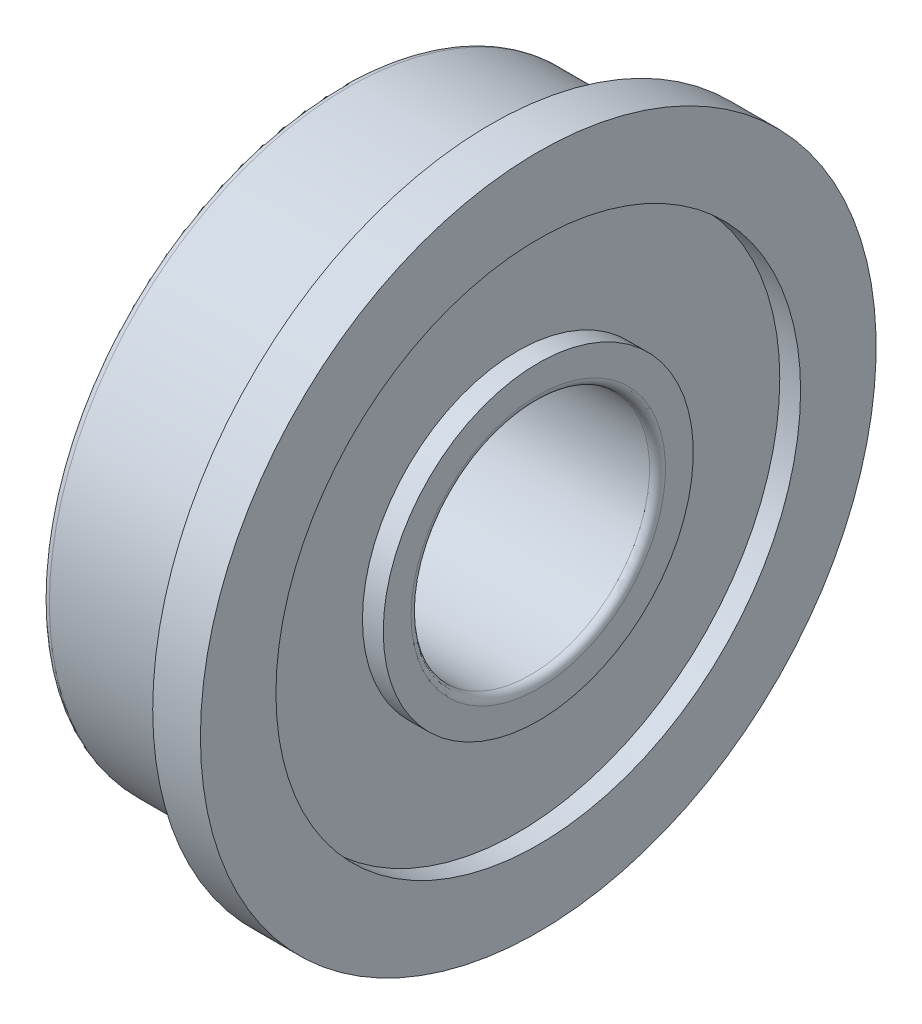
ISO-10303-21;
HEADER;
FILE_DESCRIPTION(('STEP AP214'),'2;1');
FILE_NAME('part.step','',(''),(''),'','','');
FILE_SCHEMA(('AUTOMOTIVE_DESIGN { 1 0 10303 214 1 1 1 1 }'));
ENDSEC;
DATA;
#1=APPLICATION_CONTEXT('core data for automotive mechanical design processes');
#2=APPLICATION_PROTOCOL_DEFINITION('international standard','automotive_design',2000,#1);
#3=PRODUCT_CONTEXT('',#1,'mechanical');
#4=PRODUCT('Part','Part','',(#3));
#5=PRODUCT_RELATED_PRODUCT_CATEGORY('part','',(#4));
#6=PRODUCT_DEFINITION_FORMATION('','',#4);
#7=PRODUCT_DEFINITION_CONTEXT('part definition',#1,'design');
#8=PRODUCT_DEFINITION('design','',#6,#7);
#9=PRODUCT_DEFINITION_SHAPE('','',#8);
#10=(LENGTH_UNIT() NAMED_UNIT(*) SI_UNIT(.MILLI.,.METRE.));
#11=(NAMED_UNIT(*) PLANE_ANGLE_UNIT() SI_UNIT($,.RADIAN.));
#12=(NAMED_UNIT(*) SI_UNIT($,.STERADIAN.) SOLID_ANGLE_UNIT());
#13=UNCERTAINTY_MEASURE_WITH_UNIT(LENGTH_MEASURE(1.E-05),#10,'distance_accuracy_value','');
#14=(GEOMETRIC_REPRESENTATION_CONTEXT(3) GLOBAL_UNCERTAINTY_ASSIGNED_CONTEXT((#13)) GLOBAL_UNIT_ASSIGNED_CONTEXT((#10,
#11,#12)) REPRESENTATION_CONTEXT('',''));
#15=CARTESIAN_POINT('',(0.,0.,0.));
#16=DIRECTION('',(0.,0.,1.));
#17=DIRECTION('',(1.,0.,0.));
#18=AXIS2_PLACEMENT_3D('',#15,#16,#17);
#19=CARTESIAN_POINT('',(0.200000000000016,0.,0.));
#20=DIRECTION('',(-1.,0.,0.));
#21=DIRECTION('',(0.,0.,1.));
#22=AXIS2_PLACEMENT_3D('',#19,#20,#21);
#23=TOROIDAL_SURFACE('',#22,7.29999999999998,0.200000000000016);
#24=CARTESIAN_POINT('',(0.,0.,0.));
#25=DIRECTION('',(-1.,0.,0.));
#26=DIRECTION('',(0.,0.,1.));
#27=AXIS2_PLACEMENT_3D('',#24,#25,#26);
#28=CIRCLE('',#27,7.3);
#29=CARTESIAN_POINT('',(0.,0.,7.3));
#30=VERTEX_POINT('',#29);
#31=EDGE_CURVE('E10',#30,#30,#28,.T.);
#32=ORIENTED_EDGE('',*,*,#31,.F.);
#33=EDGE_LOOP('',(#32));
#34=FACE_BOUND('',#33,.T.);
#35=CARTESIAN_POINT('',(0.200000000000001,0.,0.));
#36=DIRECTION('',(-1.,0.,0.));
#37=DIRECTION('',(0.,0.,1.));
#38=AXIS2_PLACEMENT_3D('',#35,#36,#37);
#39=CIRCLE('',#38,7.5);
#40=CARTESIAN_POINT('',(0.200000000000001,0.,7.5));
#41=VERTEX_POINT('',#40);
#42=EDGE_CURVE('E91',#41,#41,#39,.T.);
#43=ORIENTED_EDGE('',*,*,#42,.T.);
#44=EDGE_LOOP('',(#43));
#45=FACE_BOUND('',#44,.T.);
#46=ADVANCED_FACE('F33',(#34,#45),#23,.T.);
#47=CARTESIAN_POINT('',(0.,7.3,0.));
#48=DIRECTION('',(1.,0.,0.));
#49=DIRECTION('',(0.,0.,-1.));
#50=AXIS2_PLACEMENT_3D('',#47,#48,#49);
#51=PLANE('',#50);
#52=CARTESIAN_POINT('',(0.,0.,0.));
#53=DIRECTION('',(-1.,0.,0.));
#54=DIRECTION('',(0.,0.,1.));
#55=AXIS2_PLACEMENT_3D('',#52,#53,#54);
#56=CIRCLE('',#55,6.6);
#57=CARTESIAN_POINT('',(0.,0.,6.6));
#58=VERTEX_POINT('',#57);
#59=EDGE_CURVE('E39',#58,#58,#56,.T.);
#60=ORIENTED_EDGE('',*,*,#59,.F.);
#61=EDGE_LOOP('',(#60));
#62=FACE_BOUND('',#61,.T.);
#63=ORIENTED_EDGE('',*,*,#31,.T.);
#64=EDGE_LOOP('',(#63));
#65=FACE_BOUND('',#64,.T.);
#66=ADVANCED_FACE('F188',(#62,#65),#51,.F.);
#67=CARTESIAN_POINT('',(15.,0.,0.));
#68=DIRECTION('',(-1.,0.,0.));
#69=DIRECTION('',(0.,0.,1.));
#70=AXIS2_PLACEMENT_3D('',#67,#68,#69);
#71=CYLINDRICAL_SURFACE('',#70,6.6);
#72=CARTESIAN_POINT('',(0.52375,0.,0.));
#73=DIRECTION('',(-1.,0.,0.));
#74=DIRECTION('',(0.,0.,1.));
#75=AXIS2_PLACEMENT_3D('',#72,#73,#74);
#76=CIRCLE('',#75,6.6);
#77=CARTESIAN_POINT('',(0.52375,0.,6.6));
#78=VERTEX_POINT('',#77);
#79=EDGE_CURVE('E43',#78,#78,#76,.T.);
#80=ORIENTED_EDGE('',*,*,#79,.F.);
#81=EDGE_LOOP('',(#80));
#82=FACE_BOUND('',#81,.T.);
#83=ORIENTED_EDGE('',*,*,#59,.T.);
#84=EDGE_LOOP('',(#83));
#85=FACE_BOUND('',#84,.T.);
#86=ADVANCED_FACE('F183',(#82,#85),#71,.F.);
#87=CARTESIAN_POINT('',(0.52375,6.6,0.));
#88=DIRECTION('',(1.,0.,0.));
#89=DIRECTION('',(0.,0.,-1.));
#90=AXIS2_PLACEMENT_3D('',#87,#88,#89);
#91=PLANE('',#90);
#92=CARTESIAN_POINT('',(0.52375,0.,0.));
#93=DIRECTION('',(-1.,0.,0.));
#94=DIRECTION('',(0.,0.,1.));
#95=AXIS2_PLACEMENT_3D('',#92,#93,#94);
#96=CIRCLE('',#95,3.9);
#97=CARTESIAN_POINT('',(0.52375,0.,3.9));
#98=VERTEX_POINT('',#97);
#99=EDGE_CURVE('E47',#98,#98,#96,.T.);
#100=ORIENTED_EDGE('',*,*,#99,.F.);
#101=EDGE_LOOP('',(#100));
#102=FACE_BOUND('',#101,.T.);
#103=ORIENTED_EDGE('',*,*,#79,.T.);
#104=EDGE_LOOP('',(#103));
#105=FACE_BOUND('',#104,.T.);
#106=ADVANCED_FACE('F177',(#102,#105),#91,.F.);
#107=CARTESIAN_POINT('',(15.,0.,0.));
#108=DIRECTION('',(-1.,0.,0.));
#109=DIRECTION('',(0.,0.,1.));
#110=AXIS2_PLACEMENT_3D('',#107,#108,#109);
#111=CYLINDRICAL_SURFACE('',#110,3.9);
#112=CARTESIAN_POINT('',(0.,0.,0.));
#113=DIRECTION('',(-1.,0.,0.));
#114=DIRECTION('',(0.,0.,1.));
#115=AXIS2_PLACEMENT_3D('',#112,#113,#114);
#116=CIRCLE('',#115,3.9);
#117=CARTESIAN_POINT('',(0.,0.,3.9));
#118=VERTEX_POINT('',#117);
#119=EDGE_CURVE('E52',#118,#118,#116,.T.);
#120=ORIENTED_EDGE('',*,*,#119,.F.);
#121=EDGE_LOOP('',(#120));
#122=FACE_BOUND('',#121,.T.);
#123=ORIENTED_EDGE('',*,*,#99,.T.);
#124=EDGE_LOOP('',(#123));
#125=FACE_BOUND('',#124,.T.);
#126=ADVANCED_FACE('F171',(#122,#125),#111,.T.);
#127=CARTESIAN_POINT('',(0.,3.9,0.));
#128=DIRECTION('',(1.,0.,0.));
#129=DIRECTION('',(0.,0.,-1.));
#130=AXIS2_PLACEMENT_3D('',#127,#128,#129);
#131=PLANE('',#130);
#132=CARTESIAN_POINT('',(0.,0.,0.));
#133=DIRECTION('',(-1.,0.,0.));
#134=DIRECTION('',(0.,0.,1.));
#135=AXIS2_PLACEMENT_3D('',#132,#133,#134);
#136=CIRCLE('',#135,3.2);
#137=CARTESIAN_POINT('',(0.,0.,3.2));
#138=VERTEX_POINT('',#137);
#139=EDGE_CURVE('E55',#138,#138,#136,.T.);
#140=ORIENTED_EDGE('',*,*,#139,.F.);
#141=EDGE_LOOP('',(#140));
#142=FACE_BOUND('',#141,.T.);
#143=ORIENTED_EDGE('',*,*,#119,.T.);
#144=EDGE_LOOP('',(#143));
#145=FACE_BOUND('',#144,.T.);
#146=ADVANCED_FACE('F165',(#142,#145),#131,.F.);
#147=CARTESIAN_POINT('',(0.200000000000015,0.,0.));
#148=DIRECTION('',(-1.,0.,0.));
#149=DIRECTION('',(0.,0.,1.));
#150=AXIS2_PLACEMENT_3D('',#147,#148,#149);
#151=TOROIDAL_SURFACE('',#150,3.20000000000002,0.200000000000015);
#152=CARTESIAN_POINT('',(0.200000000000001,0.,0.));
#153=DIRECTION('',(-1.,0.,0.));
#154=DIRECTION('',(0.,0.,1.));
#155=AXIS2_PLACEMENT_3D('',#152,#153,#154);
#156=CIRCLE('',#155,3.);
#157=CARTESIAN_POINT('',(0.200000000000001,0.,3.));
#158=VERTEX_POINT('',#157);
#159=EDGE_CURVE('E58',#158,#158,#156,.T.);
#160=ORIENTED_EDGE('',*,*,#159,.F.);
#161=EDGE_LOOP('',(#160));
#162=FACE_BOUND('',#161,.T.);
#163=ORIENTED_EDGE('',*,*,#139,.T.);
#164=EDGE_LOOP('',(#163));
#165=FACE_BOUND('',#164,.T.);
#166=ADVANCED_FACE('F159',(#162,#165),#151,.T.);
#167=CARTESIAN_POINT('',(15.,0.,0.));
#168=DIRECTION('',(-1.,0.,0.));
#169=DIRECTION('',(0.,0.,1.));
#170=AXIS2_PLACEMENT_3D('',#167,#168,#169);
#171=CYLINDRICAL_SURFACE('',#170,3.);
#172=CARTESIAN_POINT('',(4.8,0.,0.));
#173=DIRECTION('',(-1.,0.,0.));
#174=DIRECTION('',(0.,0.,1.));
#175=AXIS2_PLACEMENT_3D('',#172,#173,#174);
#176=CIRCLE('',#175,3.);
#177=CARTESIAN_POINT('',(4.8,0.,3.));
#178=VERTEX_POINT('',#177);
#179=EDGE_CURVE('E61',#178,#178,#176,.T.);
#180=ORIENTED_EDGE('',*,*,#179,.F.);
#181=EDGE_LOOP('',(#180));
#182=FACE_BOUND('',#181,.T.);
#183=ORIENTED_EDGE('',*,*,#159,.T.);
#184=EDGE_LOOP('',(#183));
#185=FACE_BOUND('',#184,.T.);
#186=ADVANCED_FACE('F153',(#182,#185),#171,.F.);
#187=CARTESIAN_POINT('',(4.79999999999997,0.,0.));
#188=DIRECTION('',(-1.,0.,0.));
#189=DIRECTION('',(0.,0.,1.));
#190=AXIS2_PLACEMENT_3D('',#187,#188,#189);
#191=TOROIDAL_SURFACE('',#190,3.20000000000003,0.200000000000033);
#192=CARTESIAN_POINT('',(5.,0.,0.));
#193=DIRECTION('',(-1.,0.,0.));
#194=DIRECTION('',(0.,0.,1.));
#195=AXIS2_PLACEMENT_3D('',#192,#193,#194);
#196=CIRCLE('',#195,3.2);
#197=CARTESIAN_POINT('',(5.,0.,3.2));
#198=VERTEX_POINT('',#197);
#199=EDGE_CURVE('E64',#198,#198,#196,.T.);
#200=ORIENTED_EDGE('',*,*,#199,.F.);
#201=EDGE_LOOP('',(#200));
#202=FACE_BOUND('',#201,.T.);
#203=ORIENTED_EDGE('',*,*,#179,.T.);
#204=EDGE_LOOP('',(#203));
#205=FACE_BOUND('',#204,.T.);
#206=ADVANCED_FACE('F147',(#202,#205),#191,.T.);
#207=CARTESIAN_POINT('',(5.,3.2,0.));
#208=DIRECTION('',(-1.,0.,0.));
#209=DIRECTION('',(0.,0.,1.));
#210=AXIS2_PLACEMENT_3D('',#207,#208,#209);
#211=PLANE('',#210);
#212=CARTESIAN_POINT('',(5.,0.,0.));
#213=DIRECTION('',(-1.,0.,0.));
#214=DIRECTION('',(0.,0.,1.));
#215=AXIS2_PLACEMENT_3D('',#212,#213,#214);
#216=CIRCLE('',#215,3.9);
#217=CARTESIAN_POINT('',(5.,0.,3.9));
#218=VERTEX_POINT('',#217);
#219=EDGE_CURVE('E67',#218,#218,#216,.T.);
#220=ORIENTED_EDGE('',*,*,#219,.F.);
#221=EDGE_LOOP('',(#220));
#222=FACE_BOUND('',#221,.T.);
#223=ORIENTED_EDGE('',*,*,#199,.T.);
#224=EDGE_LOOP('',(#223));
#225=FACE_BOUND('',#224,.T.);
#226=ADVANCED_FACE('F141',(#222,#225),#211,.F.);
#227=CARTESIAN_POINT('',(15.,0.,0.));
#228=DIRECTION('',(-1.,0.,0.));
#229=DIRECTION('',(0.,0.,1.));
#230=AXIS2_PLACEMENT_3D('',#227,#228,#229);
#231=CYLINDRICAL_SURFACE('',#230,3.9);
#232=CARTESIAN_POINT('',(4.47625,0.,0.));
#233=DIRECTION('',(-1.,0.,0.));
#234=DIRECTION('',(0.,0.,1.));
#235=AXIS2_PLACEMENT_3D('',#232,#233,#234);
#236=CIRCLE('',#235,3.9);
#237=CARTESIAN_POINT('',(4.47625,0.,3.9));
#238=VERTEX_POINT('',#237);
#239=EDGE_CURVE('E70',#238,#238,#236,.T.);
#240=ORIENTED_EDGE('',*,*,#239,.F.);
#241=EDGE_LOOP('',(#240));
#242=FACE_BOUND('',#241,.T.);
#243=ORIENTED_EDGE('',*,*,#219,.T.);
#244=EDGE_LOOP('',(#243));
#245=FACE_BOUND('',#244,.T.);
#246=ADVANCED_FACE('F135',(#242,#245),#231,.T.);
#247=CARTESIAN_POINT('',(4.47625,3.9,0.));
#248=DIRECTION('',(-1.,0.,0.));
#249=DIRECTION('',(0.,0.,1.));
#250=AXIS2_PLACEMENT_3D('',#247,#248,#249);
#251=PLANE('',#250);
#252=CARTESIAN_POINT('',(4.47625,0.,0.));
#253=DIRECTION('',(-1.,0.,0.));
#254=DIRECTION('',(0.,0.,1.));
#255=AXIS2_PLACEMENT_3D('',#252,#253,#254);
#256=CIRCLE('',#255,6.6);
#257=CARTESIAN_POINT('',(4.47625,0.,6.6));
#258=VERTEX_POINT('',#257);
#259=EDGE_CURVE('E73',#258,#258,#256,.T.);
#260=ORIENTED_EDGE('',*,*,#259,.F.);
#261=EDGE_LOOP('',(#260));
#262=FACE_BOUND('',#261,.T.);
#263=ORIENTED_EDGE('',*,*,#239,.T.);
#264=EDGE_LOOP('',(#263));
#265=FACE_BOUND('',#264,.T.);
#266=ADVANCED_FACE('F129',(#262,#265),#251,.F.);
#267=CARTESIAN_POINT('',(15.,0.,0.));
#268=DIRECTION('',(-1.,0.,0.));
#269=DIRECTION('',(0.,0.,1.));
#270=AXIS2_PLACEMENT_3D('',#267,#268,#269);
#271=CYLINDRICAL_SURFACE('',#270,6.6);
#272=CARTESIAN_POINT('',(5.,0.,0.));
#273=DIRECTION('',(-1.,0.,0.));
#274=DIRECTION('',(0.,0.,1.));
#275=AXIS2_PLACEMENT_3D('',#272,#273,#274);
#276=CIRCLE('',#275,6.6);
#277=CARTESIAN_POINT('',(5.,0.,6.6));
#278=VERTEX_POINT('',#277);
#279=EDGE_CURVE('E76',#278,#278,#276,.T.);
#280=ORIENTED_EDGE('',*,*,#279,.F.);
#281=EDGE_LOOP('',(#280));
#282=FACE_BOUND('',#281,.T.);
#283=ORIENTED_EDGE('',*,*,#259,.T.);
#284=EDGE_LOOP('',(#283));
#285=FACE_BOUND('',#284,.T.);
#286=ADVANCED_FACE('F123',(#282,#285),#271,.F.);
#287=CARTESIAN_POINT('',(5.,6.6,0.));
#288=DIRECTION('',(-1.,0.,0.));
#289=DIRECTION('',(0.,0.,1.));
#290=AXIS2_PLACEMENT_3D('',#287,#288,#289);
#291=PLANE('',#290);
#292=CARTESIAN_POINT('',(5.,0.,0.));
#293=DIRECTION('',(-1.,0.,0.));
#294=DIRECTION('',(0.,0.,1.));
#295=AXIS2_PLACEMENT_3D('',#292,#293,#294);
#296=CIRCLE('',#295,8.5);
#297=CARTESIAN_POINT('',(5.,0.,8.5));
#298=VERTEX_POINT('',#297);
#299=EDGE_CURVE('E79',#298,#298,#296,.T.);
#300=ORIENTED_EDGE('',*,*,#299,.F.);
#301=EDGE_LOOP('',(#300));
#302=FACE_BOUND('',#301,.T.);
#303=ORIENTED_EDGE('',*,*,#279,.T.);
#304=EDGE_LOOP('',(#303));
#305=FACE_BOUND('',#304,.T.);
#306=ADVANCED_FACE('F117',(#302,#305),#291,.F.);
#307=CARTESIAN_POINT('',(15.,0.,0.));
#308=DIRECTION('',(-1.,0.,0.));
#309=DIRECTION('',(0.,0.,1.));
#310=AXIS2_PLACEMENT_3D('',#307,#308,#309);
#311=CYLINDRICAL_SURFACE('',#310,8.5);
#312=CARTESIAN_POINT('',(3.8,0.,0.));
#313=DIRECTION('',(-1.,0.,0.));
#314=DIRECTION('',(0.,0.,1.));
#315=AXIS2_PLACEMENT_3D('',#312,#313,#314);
#316=CIRCLE('',#315,8.5);
#317=CARTESIAN_POINT('',(3.8,0.,8.5));
#318=VERTEX_POINT('',#317);
#319=EDGE_CURVE('E82',#318,#318,#316,.T.);
#320=ORIENTED_EDGE('',*,*,#319,.F.);
#321=EDGE_LOOP('',(#320));
#322=FACE_BOUND('',#321,.T.);
#323=ORIENTED_EDGE('',*,*,#299,.T.);
#324=EDGE_LOOP('',(#323));
#325=FACE_BOUND('',#324,.T.);
#326=ADVANCED_FACE('F111',(#322,#325),#311,.T.);
#327=CARTESIAN_POINT('',(3.8,8.5,0.));
#328=DIRECTION('',(1.,0.,0.));
#329=DIRECTION('',(0.,0.,-1.));
#330=AXIS2_PLACEMENT_3D('',#327,#328,#329);
#331=PLANE('',#330);
#332=CARTESIAN_POINT('',(3.8,0.,0.));
#333=DIRECTION('',(-1.,0.,0.));
#334=DIRECTION('',(0.,0.,1.));
#335=AXIS2_PLACEMENT_3D('',#332,#333,#334);
#336=CIRCLE('',#335,7.7);
#337=CARTESIAN_POINT('',(3.8,0.,7.7));
#338=VERTEX_POINT('',#337);
#339=EDGE_CURVE('E85',#338,#338,#336,.T.);
#340=ORIENTED_EDGE('',*,*,#339,.F.);
#341=EDGE_LOOP('',(#340));
#342=FACE_BOUND('',#341,.T.);
#343=ORIENTED_EDGE('',*,*,#319,.T.);
#344=EDGE_LOOP('',(#343));
#345=FACE_BOUND('',#344,.T.);
#346=ADVANCED_FACE('F105',(#342,#345),#331,.F.);
#347=CARTESIAN_POINT('',(3.79999999999999,0.,0.));
#348=DIRECTION('',(-1.,0.,0.));
#349=DIRECTION('',(0.,0.,1.));
#350=AXIS2_PLACEMENT_3D('',#347,#348,#349);
#351=TOROIDAL_SURFACE('',#350,7.50000000000001,0.199999999999994);
#352=CARTESIAN_POINT('',(3.6,0.,0.));
#353=DIRECTION('',(-1.,0.,0.));
#354=DIRECTION('',(0.,0.,1.));
#355=AXIS2_PLACEMENT_3D('',#352,#353,#354);
#356=CIRCLE('',#355,7.5);
#357=CARTESIAN_POINT('',(3.6,0.,7.5));
#358=VERTEX_POINT('',#357);
#359=EDGE_CURVE('E88',#358,#358,#356,.T.);
#360=ORIENTED_EDGE('',*,*,#359,.F.);
#361=EDGE_LOOP('',(#360));
#362=FACE_BOUND('',#361,.T.);
#363=ORIENTED_EDGE('',*,*,#339,.T.);
#364=EDGE_LOOP('',(#363));
#365=FACE_BOUND('',#364,.T.);
#366=ADVANCED_FACE('F99',(#362,#365),#351,.F.);
#367=CARTESIAN_POINT('',(15.,0.,0.));
#368=DIRECTION('',(-1.,0.,0.));
#369=DIRECTION('',(0.,0.,1.));
#370=AXIS2_PLACEMENT_3D('',#367,#368,#369);
#371=CYLINDRICAL_SURFACE('',#370,7.5);
#372=ORIENTED_EDGE('',*,*,#42,.F.);
#373=EDGE_LOOP('',(#372));
#374=FACE_BOUND('',#373,.T.);
#375=ORIENTED_EDGE('',*,*,#359,.T.);
#376=EDGE_LOOP('',(#375));
#377=FACE_BOUND('',#376,.T.);
#378=ADVANCED_FACE('F96',(#374,#377),#371,.T.);
#379=CLOSED_SHELL('',(#46,#66,#86,#106,#126,#146,#166,#186,#206,#226,#246,#266,#286,#306,#326,
#346,#366,#378));
#380=MANIFOLD_SOLID_BREP('B2',#379);
#381=ADVANCED_BREP_SHAPE_REPRESENTATION('',(#18,#380),#14);
#382=SHAPE_DEFINITION_REPRESENTATION(#9,#381);
ENDSEC;
END-ISO-10303-21;
